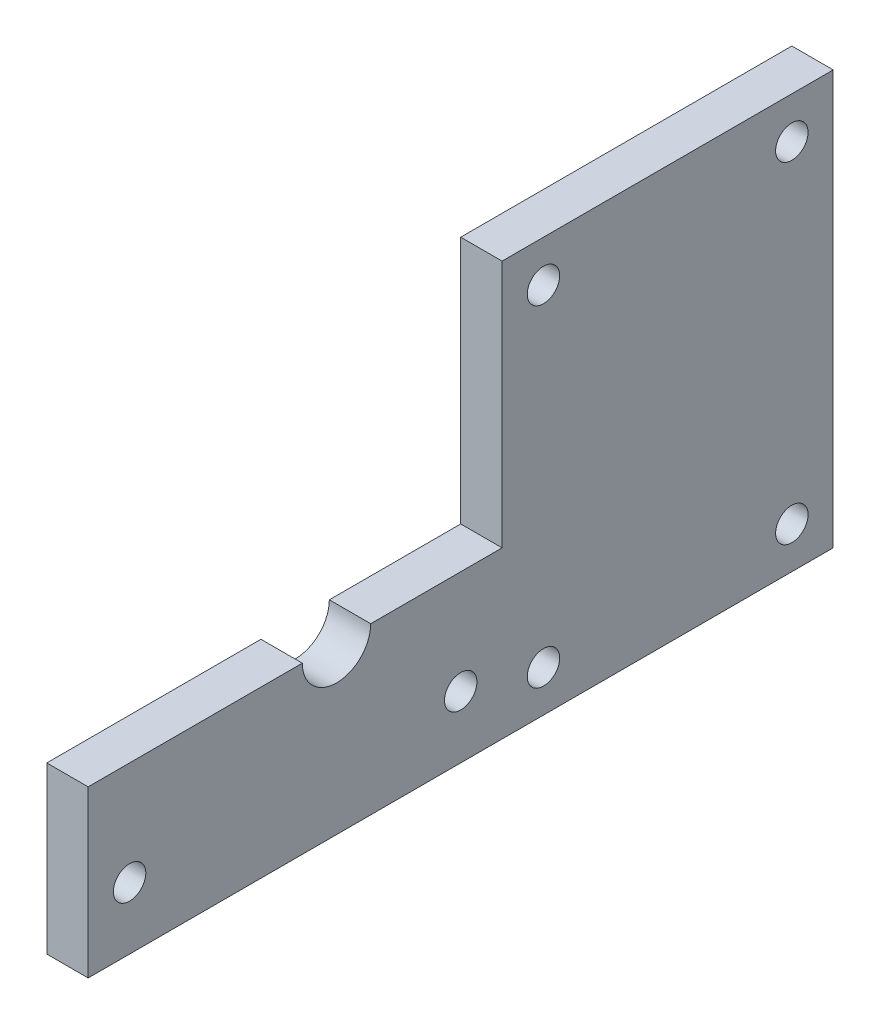
ISO-10303-21;
HEADER;
FILE_DESCRIPTION(('STEP AP214'),'2;1');
FILE_NAME('part.step','',(''),(''),'','','');
FILE_SCHEMA(('AUTOMOTIVE_DESIGN { 1 0 10303 214 1 1 1 1 }'));
ENDSEC;
DATA;
#1=APPLICATION_CONTEXT('core data for automotive mechanical design processes');
#2=APPLICATION_PROTOCOL_DEFINITION('international standard','automotive_design',2000,#1);
#3=PRODUCT_CONTEXT('',#1,'mechanical');
#4=PRODUCT('Part','Part','',(#3));
#5=PRODUCT_RELATED_PRODUCT_CATEGORY('part','',(#4));
#6=PRODUCT_DEFINITION_FORMATION('','',#4);
#7=PRODUCT_DEFINITION_CONTEXT('part definition',#1,'design');
#8=PRODUCT_DEFINITION('design','',#6,#7);
#9=PRODUCT_DEFINITION_SHAPE('','',#8);
#10=(LENGTH_UNIT() NAMED_UNIT(*) SI_UNIT(.MILLI.,.METRE.));
#11=(NAMED_UNIT(*) PLANE_ANGLE_UNIT() SI_UNIT($,.RADIAN.));
#12=(NAMED_UNIT(*) SI_UNIT($,.STERADIAN.) SOLID_ANGLE_UNIT());
#13=UNCERTAINTY_MEASURE_WITH_UNIT(LENGTH_MEASURE(1.E-05),#10,'distance_accuracy_value','');
#14=(GEOMETRIC_REPRESENTATION_CONTEXT(3) GLOBAL_UNCERTAINTY_ASSIGNED_CONTEXT((#13)) GLOBAL_UNIT_ASSIGNED_CONTEXT((#10,
#11,#12)) REPRESENTATION_CONTEXT('',''));
#15=CARTESIAN_POINT('',(0.,0.,0.));
#16=DIRECTION('',(0.,0.,1.));
#17=DIRECTION('',(1.,0.,0.));
#18=AXIS2_PLACEMENT_3D('',#15,#16,#17);
#19=CARTESIAN_POINT('',(6.35,-6.35,50.8));
#20=DIRECTION('',(0.,-1.,0.));
#21=DIRECTION('',(0.,0.,-1.));
#22=AXIS2_PLACEMENT_3D('',#19,#20,#21);
#23=PLANE('',#22);
#24=DIRECTION('',(0.,0.,1.));
#25=VECTOR('',#24,1.);
#26=CARTESIAN_POINT('',(6.35,-6.35,50.8));
#27=LINE('',#26,#25);
#28=CARTESIAN_POINT('',(6.35,-6.35,17.9451));
#29=VERTEX_POINT('',#28);
#30=CARTESIAN_POINT('',(6.35,-6.35,50.8));
#31=VERTEX_POINT('',#30);
#32=EDGE_CURVE('E102',#29,#31,#27,.T.);
#33=ORIENTED_EDGE('',*,*,#32,.F.);
#34=DIRECTION('',(-1.,0.,0.));
#35=VECTOR('',#34,1.);
#36=CARTESIAN_POINT('',(0.,-6.35,17.9451));
#37=LINE('',#36,#35);
#38=CARTESIAN_POINT('',(0.,-6.35,17.9451));
#39=VERTEX_POINT('',#38);
#40=EDGE_CURVE('E178',#29,#39,#37,.T.);
#41=ORIENTED_EDGE('',*,*,#40,.T.);
#42=DIRECTION('',(0.,0.,1.));
#43=VECTOR('',#42,1.);
#44=CARTESIAN_POINT('',(0.,-6.35,50.8));
#45=LINE('',#44,#43);
#46=CARTESIAN_POINT('',(0.,-6.35,50.8));
#47=VERTEX_POINT('',#46);
#48=EDGE_CURVE('E118',#39,#47,#45,.T.);
#49=ORIENTED_EDGE('',*,*,#48,.T.);
#50=DIRECTION('',(-1.,0.,0.));
#51=VECTOR('',#50,1.);
#52=CARTESIAN_POINT('',(6.35,-6.35,50.8));
#53=LINE('',#52,#51);
#54=EDGE_CURVE('E116',#31,#47,#53,.T.);
#55=ORIENTED_EDGE('',*,*,#54,.F.);
#56=EDGE_LOOP('',(#33,#41,#49,#55));
#57=FACE_BOUND('',#56,.T.);
#58=ADVANCED_FACE('F33',(#57),#23,.F.);
#59=CARTESIAN_POINT('',(6.35,-31.75,-63.5));
#60=DIRECTION('',(0.,0.,1.));
#61=DIRECTION('',(1.,0.,0.));
#62=AXIS2_PLACEMENT_3D('',#59,#60,#61);
#63=PLANE('',#62);
#64=DIRECTION('',(0.,1.,0.));
#65=VECTOR('',#64,1.);
#66=CARTESIAN_POINT('',(0.,-31.75,-63.5));
#67=LINE('',#66,#65);
#68=CARTESIAN_POINT('',(0.,-31.75,-63.5));
#69=VERTEX_POINT('',#68);
#70=CARTESIAN_POINT('',(0.,31.75,-63.5));
#71=VERTEX_POINT('',#70);
#72=EDGE_CURVE('E130',#69,#71,#67,.T.);
#73=ORIENTED_EDGE('',*,*,#72,.T.);
#74=DIRECTION('',(-1.,0.,0.));
#75=VECTOR('',#74,1.);
#76=CARTESIAN_POINT('',(6.35,31.75,-63.5));
#77=LINE('',#76,#75);
#78=CARTESIAN_POINT('',(6.35,31.75,-63.5));
#79=VERTEX_POINT('',#78);
#80=EDGE_CURVE('E41',#79,#71,#77,.T.);
#81=ORIENTED_EDGE('',*,*,#80,.F.);
#82=DIRECTION('',(0.,1.,0.));
#83=VECTOR('',#82,1.);
#84=CARTESIAN_POINT('',(6.35,-31.75,-63.5));
#85=LINE('',#84,#83);
#86=CARTESIAN_POINT('',(6.35,-31.75,-63.5));
#87=VERTEX_POINT('',#86);
#88=EDGE_CURVE('E144',#87,#79,#85,.T.);
#89=ORIENTED_EDGE('',*,*,#88,.F.);
#90=DIRECTION('',(-1.,0.,0.));
#91=VECTOR('',#90,1.);
#92=CARTESIAN_POINT('',(6.35,-31.75,-63.5));
#93=LINE('',#92,#91);
#94=EDGE_CURVE('E126',#87,#69,#93,.T.);
#95=ORIENTED_EDGE('',*,*,#94,.T.);
#96=EDGE_LOOP('',(#73,#81,#89,#95));
#97=FACE_BOUND('',#96,.T.);
#98=ADVANCED_FACE('F35',(#97),#63,.F.);
#99=CARTESIAN_POINT('',(6.35,31.75,-12.7));
#100=DIRECTION('',(0.,-1.,0.));
#101=DIRECTION('',(0.,0.,-1.));
#102=AXIS2_PLACEMENT_3D('',#99,#100,#101);
#103=PLANE('',#102);
#104=DIRECTION('',(0.,0.,1.));
#105=VECTOR('',#104,1.);
#106=CARTESIAN_POINT('',(0.,31.75,-12.7));
#107=LINE('',#106,#105);
#108=CARTESIAN_POINT('',(0.,31.75,-12.7));
#109=VERTEX_POINT('',#108);
#110=EDGE_CURVE('E133',#71,#109,#107,.T.);
#111=ORIENTED_EDGE('',*,*,#110,.T.);
#112=DIRECTION('',(-1.,0.,0.));
#113=VECTOR('',#112,1.);
#114=CARTESIAN_POINT('',(6.35,31.75,-12.7));
#115=LINE('',#114,#113);
#116=CARTESIAN_POINT('',(6.35,31.75,-12.7));
#117=VERTEX_POINT('',#116);
#118=EDGE_CURVE('E149',#117,#109,#115,.T.);
#119=ORIENTED_EDGE('',*,*,#118,.F.);
#120=DIRECTION('',(0.,0.,1.));
#121=VECTOR('',#120,1.);
#122=CARTESIAN_POINT('',(6.35,31.75,-12.7));
#123=LINE('',#122,#121);
#124=EDGE_CURVE('E92',#79,#117,#123,.T.);
#125=ORIENTED_EDGE('',*,*,#124,.F.);
#126=ORIENTED_EDGE('',*,*,#80,.T.);
#127=EDGE_LOOP('',(#111,#119,#125,#126));
#128=FACE_BOUND('',#127,.T.);
#129=ADVANCED_FACE('F233',(#128),#103,.F.);
#130=CARTESIAN_POINT('',(6.35,-6.35,-12.7));
#131=DIRECTION('',(0.,0.,-1.));
#132=DIRECTION('',(-1.,0.,0.));
#133=AXIS2_PLACEMENT_3D('',#130,#131,#132);
#134=PLANE('',#133);
#135=DIRECTION('',(0.,-1.,0.));
#136=VECTOR('',#135,1.);
#137=CARTESIAN_POINT('',(0.,-6.35,-12.7));
#138=LINE('',#137,#136);
#139=CARTESIAN_POINT('',(0.,-6.35,-12.7));
#140=VERTEX_POINT('',#139);
#141=EDGE_CURVE('E136',#109,#140,#138,.T.);
#142=ORIENTED_EDGE('',*,*,#141,.T.);
#143=DIRECTION('',(-1.,0.,0.));
#144=VECTOR('',#143,1.);
#145=CARTESIAN_POINT('',(6.35,-6.35,-12.7));
#146=LINE('',#145,#144);
#147=CARTESIAN_POINT('',(6.35,-6.35,-12.7));
#148=VERTEX_POINT('',#147);
#149=EDGE_CURVE('E121',#148,#140,#146,.T.);
#150=ORIENTED_EDGE('',*,*,#149,.F.);
#151=DIRECTION('',(0.,-1.,0.));
#152=VECTOR('',#151,1.);
#153=CARTESIAN_POINT('',(6.35,-6.35,-12.7));
#154=LINE('',#153,#152);
#155=EDGE_CURVE('E113',#117,#148,#154,.T.);
#156=ORIENTED_EDGE('',*,*,#155,.F.);
#157=ORIENTED_EDGE('',*,*,#118,.T.);
#158=EDGE_LOOP('',(#142,#150,#156,#157));
#159=FACE_BOUND('',#158,.T.);
#160=ADVANCED_FACE('F172',(#159),#134,.F.);
#161=CARTESIAN_POINT('',(0.,-6.35,7.45490000000004));
#162=VERTEX_POINT('',#161);
#163=EDGE_CURVE('E138',#140,#162,#45,.T.);
#164=ORIENTED_EDGE('',*,*,#163,.T.);
#165=DIRECTION('',(-1.,0.,0.));
#166=VECTOR('',#165,1.);
#167=CARTESIAN_POINT('',(0.,-6.35,7.45490000000004));
#168=LINE('',#167,#166);
#169=CARTESIAN_POINT('',(6.35,-6.35,7.45490000000004));
#170=VERTEX_POINT('',#169);
#171=EDGE_CURVE('E47',#162,#170,#168,.F.);
#172=ORIENTED_EDGE('',*,*,#171,.T.);
#173=EDGE_CURVE('E112',#148,#170,#27,.T.);
#174=ORIENTED_EDGE('',*,*,#173,.F.);
#175=ORIENTED_EDGE('',*,*,#149,.T.);
#176=EDGE_LOOP('',(#164,#172,#174,#175));
#177=FACE_BOUND('',#176,.T.);
#178=ADVANCED_FACE('F176',(#177),#23,.F.);
#179=CARTESIAN_POINT('',(6.35,-31.75,50.8));
#180=DIRECTION('',(0.,0.,-1.));
#181=DIRECTION('',(-1.,0.,0.));
#182=AXIS2_PLACEMENT_3D('',#179,#180,#181);
#183=PLANE('',#182);
#184=DIRECTION('',(0.,-1.,0.));
#185=VECTOR('',#184,1.);
#186=CARTESIAN_POINT('',(0.,-31.75,50.8));
#187=LINE('',#186,#185);
#188=CARTESIAN_POINT('',(0.,-31.75,50.8));
#189=VERTEX_POINT('',#188);
#190=EDGE_CURVE('E141',#47,#189,#187,.T.);
#191=ORIENTED_EDGE('',*,*,#190,.T.);
#192=DIRECTION('',(-1.,0.,0.));
#193=VECTOR('',#192,1.);
#194=CARTESIAN_POINT('',(6.35,-31.75,50.8));
#195=LINE('',#194,#193);
#196=CARTESIAN_POINT('',(6.35,-31.75,50.8));
#197=VERTEX_POINT('',#196);
#198=EDGE_CURVE('E122',#197,#189,#195,.T.);
#199=ORIENTED_EDGE('',*,*,#198,.F.);
#200=DIRECTION('',(0.,-1.,0.));
#201=VECTOR('',#200,1.);
#202=CARTESIAN_POINT('',(6.35,-31.75,50.8));
#203=LINE('',#202,#201);
#204=EDGE_CURVE('E107',#31,#197,#203,.T.);
#205=ORIENTED_EDGE('',*,*,#204,.F.);
#206=ORIENTED_EDGE('',*,*,#54,.T.);
#207=EDGE_LOOP('',(#191,#199,#205,#206));
#208=FACE_BOUND('',#207,.T.);
#209=ADVANCED_FACE('F124',(#208),#183,.F.);
#210=CARTESIAN_POINT('',(6.35,-31.75,50.8));
#211=DIRECTION('',(0.,1.,0.));
#212=DIRECTION('',(0.,0.,1.));
#213=AXIS2_PLACEMENT_3D('',#210,#211,#212);
#214=PLANE('',#213);
#215=DIRECTION('',(0.,0.,-1.));
#216=VECTOR('',#215,1.);
#217=CARTESIAN_POINT('',(0.,-31.75,50.8));
#218=LINE('',#217,#216);
#219=EDGE_CURVE('E83',#189,#69,#218,.T.);
#220=ORIENTED_EDGE('',*,*,#219,.T.);
#221=ORIENTED_EDGE('',*,*,#94,.F.);
#222=DIRECTION('',(0.,0.,-1.));
#223=VECTOR('',#222,1.);
#224=CARTESIAN_POINT('',(6.35,-31.75,50.8));
#225=LINE('',#224,#223);
#226=EDGE_CURVE('E56',#197,#87,#225,.T.);
#227=ORIENTED_EDGE('',*,*,#226,.F.);
#228=ORIENTED_EDGE('',*,*,#198,.T.);
#229=EDGE_LOOP('',(#220,#221,#227,#228));
#230=FACE_BOUND('',#229,.T.);
#231=ADVANCED_FACE('F223',(#230),#214,.F.);
#232=CARTESIAN_POINT('',(6.35,0.,0.));
#233=DIRECTION('',(-1.,0.,0.));
#234=DIRECTION('',(0.,0.,1.));
#235=AXIS2_PLACEMENT_3D('',#232,#233,#234);
#236=PLANE('',#235);
#237=CARTESIAN_POINT('',(6.35,-25.4,-57.15));
#238=DIRECTION('',(-1.,0.,0.));
#239=DIRECTION('',(0.,0.,1.));
#240=AXIS2_PLACEMENT_3D('',#237,#238,#239);
#241=CIRCLE('',#240,2.48919999999999);
#242=CARTESIAN_POINT('',(6.35,-25.4,-54.6608));
#243=VERTEX_POINT('',#242);
#244=EDGE_CURVE('E186',#243,#243,#241,.T.);
#245=ORIENTED_EDGE('',*,*,#244,.T.);
#246=EDGE_LOOP('',(#245));
#247=FACE_BOUND('',#246,.T.);
#248=CARTESIAN_POINT('',(6.35,-25.4,-19.05));
#249=DIRECTION('',(-1.,0.,0.));
#250=DIRECTION('',(0.,0.,1.));
#251=AXIS2_PLACEMENT_3D('',#248,#249,#250);
#252=CIRCLE('',#251,2.48919999999998);
#253=CARTESIAN_POINT('',(6.35,-25.4,-16.5608));
#254=VERTEX_POINT('',#253);
#255=EDGE_CURVE('E192',#254,#254,#252,.T.);
#256=ORIENTED_EDGE('',*,*,#255,.T.);
#257=EDGE_LOOP('',(#256));
#258=FACE_BOUND('',#257,.T.);
#259=CARTESIAN_POINT('',(6.35,25.4,-19.05));
#260=DIRECTION('',(-1.,0.,0.));
#261=DIRECTION('',(0.,0.,1.));
#262=AXIS2_PLACEMENT_3D('',#259,#260,#261);
#263=CIRCLE('',#262,2.48919999999998);
#264=CARTESIAN_POINT('',(6.35,25.4,-16.5608));
#265=VERTEX_POINT('',#264);
#266=EDGE_CURVE('E198',#265,#265,#263,.T.);
#267=ORIENTED_EDGE('',*,*,#266,.T.);
#268=EDGE_LOOP('',(#267));
#269=FACE_BOUND('',#268,.T.);
#270=CARTESIAN_POINT('',(6.35,25.4,-57.15));
#271=DIRECTION('',(-1.,0.,0.));
#272=DIRECTION('',(0.,0.,1.));
#273=AXIS2_PLACEMENT_3D('',#270,#271,#272);
#274=CIRCLE('',#273,2.48919999999999);
#275=CARTESIAN_POINT('',(6.35,25.4,-54.6608));
#276=VERTEX_POINT('',#275);
#277=EDGE_CURVE('E204',#276,#276,#274,.T.);
#278=ORIENTED_EDGE('',*,*,#277,.T.);
#279=EDGE_LOOP('',(#278));
#280=FACE_BOUND('',#279,.T.);
#281=CARTESIAN_POINT('',(6.35,-22.225,44.45));
#282=DIRECTION('',(-1.,0.,0.));
#283=DIRECTION('',(0.,0.,1.));
#284=AXIS2_PLACEMENT_3D('',#281,#282,#283);
#285=CIRCLE('',#284,2.48919999999999);
#286=CARTESIAN_POINT('',(6.35,-22.225,46.9392));
#287=VERTEX_POINT('',#286);
#288=EDGE_CURVE('E157',#287,#287,#285,.T.);
#289=ORIENTED_EDGE('',*,*,#288,.T.);
#290=EDGE_LOOP('',(#289));
#291=FACE_BOUND('',#290,.T.);
#292=CARTESIAN_POINT('',(6.35,-22.225,-6.34999999999997));
#293=DIRECTION('',(-1.,0.,0.));
#294=DIRECTION('',(0.,0.,1.));
#295=AXIS2_PLACEMENT_3D('',#292,#293,#294);
#296=CIRCLE('',#295,2.48919999999999);
#297=CARTESIAN_POINT('',(6.35,-22.225,-3.86079999999999));
#298=VERTEX_POINT('',#297);
#299=EDGE_CURVE('E134',#298,#298,#296,.T.);
#300=ORIENTED_EDGE('',*,*,#299,.T.);
#301=EDGE_LOOP('',(#300));
#302=FACE_BOUND('',#301,.T.);
#303=ORIENTED_EDGE('',*,*,#173,.T.);
#304=CARTESIAN_POINT('',(6.35,-6.35,12.7));
#305=DIRECTION('',(-1.,0.,0.));
#306=DIRECTION('',(0.,0.,1.));
#307=AXIS2_PLACEMENT_3D('',#304,#305,#306);
#308=CIRCLE('',#307,5.24509999999999);
#309=EDGE_CURVE('E109',#170,#29,#308,.T.);
#310=ORIENTED_EDGE('',*,*,#309,.T.);
#311=ORIENTED_EDGE('',*,*,#32,.T.);
#312=ORIENTED_EDGE('',*,*,#204,.T.);
#313=ORIENTED_EDGE('',*,*,#226,.T.);
#314=ORIENTED_EDGE('',*,*,#88,.T.);
#315=ORIENTED_EDGE('',*,*,#124,.T.);
#316=ORIENTED_EDGE('',*,*,#155,.T.);
#317=EDGE_LOOP('',(#303,#310,#311,#312,#313,#314,#315,#316));
#318=FACE_BOUND('',#317,.T.);
#319=ADVANCED_FACE('F105',(#247,#258,#269,#280,#291,#302,#318),#236,.F.);
#320=CARTESIAN_POINT('',(0.,0.,0.));
#321=DIRECTION('',(-1.,0.,0.));
#322=DIRECTION('',(0.,0.,1.));
#323=AXIS2_PLACEMENT_3D('',#320,#321,#322);
#324=PLANE('',#323);
#325=CARTESIAN_POINT('',(0.,-6.35,12.7));
#326=DIRECTION('',(-1.,0.,0.));
#327=DIRECTION('',(0.,0.,1.));
#328=AXIS2_PLACEMENT_3D('',#325,#326,#327);
#329=CIRCLE('',#328,5.24509999999999);
#330=EDGE_CURVE('E11',#162,#39,#329,.T.);
#331=ORIENTED_EDGE('',*,*,#330,.F.);
#332=ORIENTED_EDGE('',*,*,#163,.F.);
#333=ORIENTED_EDGE('',*,*,#141,.F.);
#334=ORIENTED_EDGE('',*,*,#110,.F.);
#335=ORIENTED_EDGE('',*,*,#72,.F.);
#336=ORIENTED_EDGE('',*,*,#219,.F.);
#337=ORIENTED_EDGE('',*,*,#190,.F.);
#338=ORIENTED_EDGE('',*,*,#48,.F.);
#339=EDGE_LOOP('',(#331,#332,#333,#334,#335,#336,#337,#338));
#340=FACE_BOUND('',#339,.T.);
#341=CARTESIAN_POINT('',(0.,-25.4,-57.15));
#342=DIRECTION('',(-1.,0.,0.));
#343=DIRECTION('',(0.,0.,1.));
#344=AXIS2_PLACEMENT_3D('',#341,#342,#343);
#345=CIRCLE('',#344,2.48919999999999);
#346=CARTESIAN_POINT('',(0.,-25.4,-54.6608));
#347=VERTEX_POINT('',#346);
#348=EDGE_CURVE('E180',#347,#347,#345,.T.);
#349=ORIENTED_EDGE('',*,*,#348,.F.);
#350=EDGE_LOOP('',(#349));
#351=FACE_BOUND('',#350,.T.);
#352=CARTESIAN_POINT('',(0.,-25.4,-19.05));
#353=DIRECTION('',(-1.,0.,0.));
#354=DIRECTION('',(0.,0.,1.));
#355=AXIS2_PLACEMENT_3D('',#352,#353,#354);
#356=CIRCLE('',#355,2.48919999999999);
#357=CARTESIAN_POINT('',(0.,-25.4,-16.5608));
#358=VERTEX_POINT('',#357);
#359=EDGE_CURVE('E189',#358,#358,#356,.T.);
#360=ORIENTED_EDGE('',*,*,#359,.F.);
#361=EDGE_LOOP('',(#360));
#362=FACE_BOUND('',#361,.T.);
#363=CARTESIAN_POINT('',(0.,25.4,-19.05));
#364=DIRECTION('',(-1.,0.,0.));
#365=DIRECTION('',(0.,0.,1.));
#366=AXIS2_PLACEMENT_3D('',#363,#364,#365);
#367=CIRCLE('',#366,2.48919999999999);
#368=CARTESIAN_POINT('',(0.,25.4,-16.5608));
#369=VERTEX_POINT('',#368);
#370=EDGE_CURVE('E195',#369,#369,#367,.T.);
#371=ORIENTED_EDGE('',*,*,#370,.F.);
#372=EDGE_LOOP('',(#371));
#373=FACE_BOUND('',#372,.T.);
#374=CARTESIAN_POINT('',(0.,25.4,-57.15));
#375=DIRECTION('',(-1.,0.,0.));
#376=DIRECTION('',(0.,0.,1.));
#377=AXIS2_PLACEMENT_3D('',#374,#375,#376);
#378=CIRCLE('',#377,2.48919999999999);
#379=CARTESIAN_POINT('',(0.,25.4,-54.6608));
#380=VERTEX_POINT('',#379);
#381=EDGE_CURVE('E201',#380,#380,#378,.T.);
#382=ORIENTED_EDGE('',*,*,#381,.F.);
#383=EDGE_LOOP('',(#382));
#384=FACE_BOUND('',#383,.T.);
#385=CARTESIAN_POINT('',(0.,-22.225,44.45));
#386=DIRECTION('',(-1.,0.,0.));
#387=DIRECTION('',(0.,0.,1.));
#388=AXIS2_PLACEMENT_3D('',#385,#386,#387);
#389=CIRCLE('',#388,2.48919999999999);
#390=CARTESIAN_POINT('',(0.,-22.225,46.9392));
#391=VERTEX_POINT('',#390);
#392=EDGE_CURVE('E162',#391,#391,#389,.T.);
#393=ORIENTED_EDGE('',*,*,#392,.F.);
#394=EDGE_LOOP('',(#393));
#395=FACE_BOUND('',#394,.T.);
#396=CARTESIAN_POINT('',(0.,-22.225,-6.34999999999997));
#397=DIRECTION('',(-1.,0.,0.));
#398=DIRECTION('',(0.,0.,1.));
#399=AXIS2_PLACEMENT_3D('',#396,#397,#398);
#400=CIRCLE('',#399,2.48919999999999);
#401=CARTESIAN_POINT('',(0.,-22.225,-3.86079999999998));
#402=VERTEX_POINT('',#401);
#403=EDGE_CURVE('E153',#402,#402,#400,.T.);
#404=ORIENTED_EDGE('',*,*,#403,.F.);
#405=EDGE_LOOP('',(#404));
#406=FACE_BOUND('',#405,.T.);
#407=ADVANCED_FACE('F212',(#340,#351,#362,#373,#384,#395,#406),#324,.T.);
#408=CARTESIAN_POINT('',(0.,-22.225,-6.34999999999997));
#409=DIRECTION('',(-1.,0.,0.));
#410=DIRECTION('',(0.,0.,1.));
#411=AXIS2_PLACEMENT_3D('',#408,#409,#410);
#412=CYLINDRICAL_SURFACE('',#411,2.48919999999999);
#413=ORIENTED_EDGE('',*,*,#403,.T.);
#414=EDGE_LOOP('',(#413));
#415=FACE_BOUND('',#414,.T.);
#416=ORIENTED_EDGE('',*,*,#299,.F.);
#417=EDGE_LOOP('',(#416));
#418=FACE_BOUND('',#417,.T.);
#419=ADVANCED_FACE('F215',(#415,#418),#412,.F.);
#420=CARTESIAN_POINT('',(0.,-22.225,44.45));
#421=DIRECTION('',(-1.,0.,0.));
#422=DIRECTION('',(0.,0.,1.));
#423=AXIS2_PLACEMENT_3D('',#420,#421,#422);
#424=CYLINDRICAL_SURFACE('',#423,2.48919999999999);
#425=ORIENTED_EDGE('',*,*,#392,.T.);
#426=EDGE_LOOP('',(#425));
#427=FACE_BOUND('',#426,.T.);
#428=ORIENTED_EDGE('',*,*,#288,.F.);
#429=EDGE_LOOP('',(#428));
#430=FACE_BOUND('',#429,.T.);
#431=ADVANCED_FACE('F209',(#427,#430),#424,.F.);
#432=CARTESIAN_POINT('',(0.,25.4,-57.15));
#433=DIRECTION('',(-1.,0.,0.));
#434=DIRECTION('',(0.,0.,1.));
#435=AXIS2_PLACEMENT_3D('',#432,#433,#434);
#436=CYLINDRICAL_SURFACE('',#435,2.48919999999999);
#437=ORIENTED_EDGE('',*,*,#381,.T.);
#438=EDGE_LOOP('',(#437));
#439=FACE_BOUND('',#438,.T.);
#440=ORIENTED_EDGE('',*,*,#277,.F.);
#441=EDGE_LOOP('',(#440));
#442=FACE_BOUND('',#441,.T.);
#443=ADVANCED_FACE('F268',(#439,#442),#436,.F.);
#444=CARTESIAN_POINT('',(0.,25.4,-19.05));
#445=DIRECTION('',(-1.,0.,0.));
#446=DIRECTION('',(0.,0.,1.));
#447=AXIS2_PLACEMENT_3D('',#444,#445,#446);
#448=CYLINDRICAL_SURFACE('',#447,2.48919999999998);
#449=ORIENTED_EDGE('',*,*,#370,.T.);
#450=EDGE_LOOP('',(#449));
#451=FACE_BOUND('',#450,.T.);
#452=ORIENTED_EDGE('',*,*,#266,.F.);
#453=EDGE_LOOP('',(#452));
#454=FACE_BOUND('',#453,.T.);
#455=ADVANCED_FACE('F264',(#451,#454),#448,.F.);
#456=CARTESIAN_POINT('',(0.,-25.4,-19.05));
#457=DIRECTION('',(-1.,0.,0.));
#458=DIRECTION('',(0.,0.,1.));
#459=AXIS2_PLACEMENT_3D('',#456,#457,#458);
#460=CYLINDRICAL_SURFACE('',#459,2.48919999999998);
#461=ORIENTED_EDGE('',*,*,#359,.T.);
#462=EDGE_LOOP('',(#461));
#463=FACE_BOUND('',#462,.T.);
#464=ORIENTED_EDGE('',*,*,#255,.F.);
#465=EDGE_LOOP('',(#464));
#466=FACE_BOUND('',#465,.T.);
#467=ADVANCED_FACE('F258',(#463,#466),#460,.F.);
#468=CARTESIAN_POINT('',(0.,-25.4,-57.15));
#469=DIRECTION('',(-1.,0.,0.));
#470=DIRECTION('',(0.,0.,1.));
#471=AXIS2_PLACEMENT_3D('',#468,#469,#470);
#472=CYLINDRICAL_SURFACE('',#471,2.48919999999999);
#473=ORIENTED_EDGE('',*,*,#348,.T.);
#474=EDGE_LOOP('',(#473));
#475=FACE_BOUND('',#474,.T.);
#476=ORIENTED_EDGE('',*,*,#244,.F.);
#477=EDGE_LOOP('',(#476));
#478=FACE_BOUND('',#477,.T.);
#479=ADVANCED_FACE('F253',(#475,#478),#472,.F.);
#480=CARTESIAN_POINT('',(0.,-6.35,12.7));
#481=DIRECTION('',(-1.,0.,0.));
#482=DIRECTION('',(0.,0.,1.));
#483=AXIS2_PLACEMENT_3D('',#480,#481,#482);
#484=CYLINDRICAL_SURFACE('',#483,5.24509999999999);
#485=ORIENTED_EDGE('',*,*,#309,.F.);
#486=ORIENTED_EDGE('',*,*,#171,.F.);
#487=ORIENTED_EDGE('',*,*,#330,.T.);
#488=ORIENTED_EDGE('',*,*,#40,.F.);
#489=EDGE_LOOP('',(#485,#486,#487,#488));
#490=FACE_BOUND('',#489,.T.);
#491=ADVANCED_FACE('F250',(#490),#484,.F.);
#492=CLOSED_SHELL('',(#58,#98,#129,#160,#178,#209,#231,#319,#407,#419,#431,#443,#455,#467,#479,#491));
#493=MANIFOLD_SOLID_BREP('B2',#492);
#494=ADVANCED_BREP_SHAPE_REPRESENTATION('',(#18,#493),#14);
#495=SHAPE_DEFINITION_REPRESENTATION(#9,#494);
ENDSEC;
END-ISO-10303-21;
